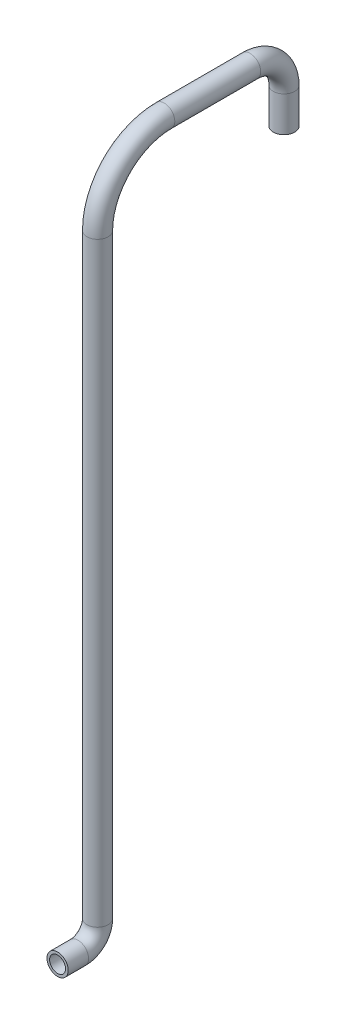
ISO-10303-21;
HEADER;
FILE_DESCRIPTION(('STEP AP214'),'2;1');
FILE_NAME('part.step','',(''),(''),'','','');
FILE_SCHEMA(('AUTOMOTIVE_DESIGN { 1 0 10303 214 1 1 1 1 }'));
ENDSEC;
DATA;
#1=APPLICATION_CONTEXT('core data for automotive mechanical design processes');
#2=APPLICATION_PROTOCOL_DEFINITION('international standard','automotive_design',2000,#1);
#3=PRODUCT_CONTEXT('',#1,'mechanical');
#4=PRODUCT('Part','Part','',(#3));
#5=PRODUCT_RELATED_PRODUCT_CATEGORY('part','',(#4));
#6=PRODUCT_DEFINITION_FORMATION('','',#4);
#7=PRODUCT_DEFINITION_CONTEXT('part definition',#1,'design');
#8=PRODUCT_DEFINITION('design','',#6,#7);
#9=PRODUCT_DEFINITION_SHAPE('','',#8);
#10=(LENGTH_UNIT() NAMED_UNIT(*) SI_UNIT(.MILLI.,.METRE.));
#11=(NAMED_UNIT(*) PLANE_ANGLE_UNIT() SI_UNIT($,.RADIAN.));
#12=(NAMED_UNIT(*) SI_UNIT($,.STERADIAN.) SOLID_ANGLE_UNIT());
#13=UNCERTAINTY_MEASURE_WITH_UNIT(LENGTH_MEASURE(1.E-05),#10,'distance_accuracy_value','');
#14=(GEOMETRIC_REPRESENTATION_CONTEXT(3) GLOBAL_UNCERTAINTY_ASSIGNED_CONTEXT((#13)) GLOBAL_UNIT_ASSIGNED_CONTEXT((#10,
#11,#12)) REPRESENTATION_CONTEXT('',''));
#15=CARTESIAN_POINT('',(0.,0.,0.));
#16=DIRECTION('',(0.,0.,1.));
#17=DIRECTION('',(1.,0.,0.));
#18=AXIS2_PLACEMENT_3D('',#15,#16,#17);
#19=CARTESIAN_POINT('',(0.,230.,-85.));
#20=DIRECTION('',(0.,1.,0.));
#21=DIRECTION('',(0.,0.,1.));
#22=AXIS2_PLACEMENT_3D('',#19,#20,#21);
#23=PLANE('',#22);
#24=CARTESIAN_POINT('',(0.,230.,-85.));
#25=DIRECTION('',(0.,1.,0.));
#26=DIRECTION('',(0.,0.,1.));
#27=AXIS2_PLACEMENT_3D('',#24,#25,#26);
#28=CIRCLE('',#27,3.);
#29=CARTESIAN_POINT('',(0.,230.,-82.));
#30=VERTEX_POINT('',#29);
#31=EDGE_CURVE('E286',#30,#30,#28,.T.);
#32=ORIENTED_EDGE('',*,*,#31,.T.);
#33=EDGE_LOOP('',(#32));
#34=FACE_BOUND('',#33,.T.);
#35=CARTESIAN_POINT('',(0.,230.,-85.));
#36=DIRECTION('',(0.,1.,0.));
#37=DIRECTION('',(0.,0.,1.));
#38=AXIS2_PLACEMENT_3D('',#35,#36,#37);
#39=CIRCLE('',#38,4.);
#40=CARTESIAN_POINT('',(0.,230.,-81.));
#41=VERTEX_POINT('',#40);
#42=EDGE_CURVE('E70',#41,#41,#39,.T.);
#43=ORIENTED_EDGE('',*,*,#42,.F.);
#44=EDGE_LOOP('',(#43));
#45=FACE_BOUND('',#44,.T.);
#46=ADVANCED_FACE('F67',(#34,#45),#23,.F.);
#47=CARTESIAN_POINT('',(0.,0.,0.));
#48=DIRECTION('',(0.,0.,1.));
#49=DIRECTION('',(0.,-1.,0.));
#50=AXIS2_PLACEMENT_3D('',#47,#48,#49);
#51=PLANE('',#50);
#52=CARTESIAN_POINT('',(0.,0.,0.));
#53=DIRECTION('',(0.,0.,1.));
#54=DIRECTION('',(0.,-1.,0.));
#55=AXIS2_PLACEMENT_3D('',#52,#53,#54);
#56=CIRCLE('',#55,3.);
#57=CARTESIAN_POINT('',(0.,-2.99999999999994,0.));
#58=VERTEX_POINT('',#57);
#59=EDGE_CURVE('E297',#58,#58,#56,.T.);
#60=ORIENTED_EDGE('',*,*,#59,.F.);
#61=EDGE_LOOP('',(#60));
#62=FACE_BOUND('',#61,.T.);
#63=CARTESIAN_POINT('',(0.,0.,0.));
#64=DIRECTION('',(0.,0.,1.));
#65=DIRECTION('',(0.,-1.,0.));
#66=AXIS2_PLACEMENT_3D('',#63,#64,#65);
#67=CIRCLE('',#66,4.);
#68=CARTESIAN_POINT('',(0.,-3.99999999999994,0.));
#69=VERTEX_POINT('',#68);
#70=EDGE_CURVE('E84',#69,#69,#67,.T.);
#71=ORIENTED_EDGE('',*,*,#70,.T.);
#72=EDGE_LOOP('',(#71));
#73=FACE_BOUND('',#72,.T.);
#74=ADVANCED_FACE('F108',(#62,#73),#51,.T.);
#75=CARTESIAN_POINT('',(0.,243.26,-85.));
#76=DIRECTION('',(0.,-1.,0.));
#77=DIRECTION('',(0.,0.,-1.));
#78=AXIS2_PLACEMENT_3D('',#75,#76,#77);
#79=CYLINDRICAL_SURFACE('',#78,4.);
#80=ORIENTED_EDGE('',*,*,#42,.T.);
#81=EDGE_LOOP('',(#80));
#82=FACE_BOUND('',#81,.T.);
#83=CARTESIAN_POINT('',(0.,243.26,-85.));
#84=DIRECTION('',(0.,0.999999999999995,1.05137579974254E-07));
#85=DIRECTION('',(0.,-1.05137579974254E-07,0.999999999999994));
#86=AXIS2_PLACEMENT_3D('',#83,#84,#85);
#87=CIRCLE('',#86,4.);
#88=CARTESIAN_POINT('',(0.,243.26000042055,-89.));
#89=VERTEX_POINT('',#88);
#90=EDGE_CURVE('E95',#89,#89,#87,.T.);
#91=ORIENTED_EDGE('',*,*,#90,.F.);
#92=EDGE_LOOP('',(#91));
#93=FACE_BOUND('',#92,.T.);
#94=ADVANCED_FACE('F106',(#82,#93),#79,.T.);
#95=CARTESIAN_POINT('',(0.,256.,-40.));
#96=DIRECTION('',(0.,0.,-1.));
#97=DIRECTION('',(-1.,0.,0.));
#98=AXIS2_PLACEMENT_3D('',#95,#96,#97);
#99=CYLINDRICAL_SURFACE('',#98,4.);
#100=CARTESIAN_POINT('',(0.,256.,-72.259998660547));
#101=DIRECTION('',(0.,0.,1.));
#102=DIRECTION('',(0.,-1.,0.));
#103=AXIS2_PLACEMENT_3D('',#100,#101,#102);
#104=CIRCLE('',#103,4.);
#105=CARTESIAN_POINT('',(0.,260.,-72.259998660547));
#106=VERTEX_POINT('',#105);
#107=EDGE_CURVE('E92',#106,#106,#104,.T.);
#108=ORIENTED_EDGE('',*,*,#107,.T.);
#109=EDGE_LOOP('',(#108));
#110=FACE_BOUND('',#109,.T.);
#111=CARTESIAN_POINT('',(0.,256.,-40.));
#112=DIRECTION('',(0.,6.42331454317771E-08,0.999999999999998));
#113=DIRECTION('',(0.,-0.999999999999998,6.42331454317771E-08));
#114=AXIS2_PLACEMENT_3D('',#111,#112,#113);
#115=CIRCLE('',#114,4.);
#116=CARTESIAN_POINT('',(0.,260.,-40.0000002569325));
#117=VERTEX_POINT('',#116);
#118=EDGE_CURVE('E93',#117,#117,#115,.T.);
#119=ORIENTED_EDGE('',*,*,#118,.F.);
#120=EDGE_LOOP('',(#119));
#121=FACE_BOUND('',#120,.T.);
#122=ADVANCED_FACE('F107',(#110,#121),#99,.T.);
#123=CARTESIAN_POINT('',(0.,243.259998660547,-72.2599986605471));
#124=DIRECTION('',(-1.,0.,0.));
#125=DIRECTION('',(0.,0.,1.));
#126=AXIS2_PLACEMENT_3D('',#123,#124,#125);
#127=TOROIDAL_SURFACE('',#126,12.740001339453,4.);
#128=CARTESIAN_POINT('',(0.,243.259998660547,-72.2599986605471));
#129=DIRECTION('',(-1.,0.,0.));
#130=DIRECTION('',(0.,0.,1.));
#131=AXIS2_PLACEMENT_3D('',#128,#129,#130);
#132=CIRCLE('',#131,16.740001339453);
#133=EDGE_CURVE('',#106,#89,#132,.T.);
#134=ORIENTED_EDGE('',*,*,#107,.F.);
#135=ORIENTED_EDGE('',*,*,#90,.T.);
#136=ORIENTED_EDGE('',*,*,#133,.T.);
#137=ORIENTED_EDGE('',*,*,#133,.F.);
#138=EDGE_LOOP('',(#134,#136,#135,#137));
#139=FACE_BOUND('',#138,.T.);
#140=ADVANCED_FACE('F103',(#139),#127,.T.);
#141=CARTESIAN_POINT('',(0.,7.34999999999997,-14.9999999999999));
#142=DIRECTION('',(0.,1.,0.));
#143=DIRECTION('',(0.,0.,1.));
#144=AXIS2_PLACEMENT_3D('',#141,#142,#143);
#145=CYLINDRICAL_SURFACE('',#144,4.);
#146=CARTESIAN_POINT('',(0.,231.000001605829,-14.9999999999999));
#147=DIRECTION('',(0.,-1.,0.));
#148=DIRECTION('',(0.,0.,-1.));
#149=AXIS2_PLACEMENT_3D('',#146,#147,#148);
#150=CIRCLE('',#149,4.);
#151=CARTESIAN_POINT('',(0.,231.000001605829,-10.9999999999999));
#152=VERTEX_POINT('',#151);
#153=EDGE_CURVE('E87',#152,#152,#150,.T.);
#154=ORIENTED_EDGE('',*,*,#153,.T.);
#155=EDGE_LOOP('',(#154));
#156=FACE_BOUND('',#155,.T.);
#157=CARTESIAN_POINT('',(0.,7.34999999999994,-14.9999999999999));
#158=DIRECTION('',(0.,-0.999999999999997,-7.35235215500691E-08));
#159=DIRECTION('',(0.,7.3523521550069E-08,-0.999999999999997));
#160=AXIS2_PLACEMENT_3D('',#157,#158,#159);
#161=CIRCLE('',#160,4.);
#162=CARTESIAN_POINT('',(0.,7.35000029409399,-18.9999999999999));
#163=VERTEX_POINT('',#162);
#164=EDGE_CURVE('E11',#163,#163,#161,.T.);
#165=ORIENTED_EDGE('',*,*,#164,.F.);
#166=EDGE_LOOP('',(#165));
#167=FACE_BOUND('',#166,.T.);
#168=ADVANCED_FACE('F137',(#156,#167),#145,.T.);
#169=CARTESIAN_POINT('',(0.,231.000001605829,-39.9999983941715));
#170=DIRECTION('',(-1.,0.,0.));
#171=DIRECTION('',(0.,0.,1.));
#172=AXIS2_PLACEMENT_3D('',#169,#170,#171);
#173=TOROIDAL_SURFACE('',#172,24.9999983941716,4.);
#174=CARTESIAN_POINT('',(0.,231.000001605829,-39.9999983941715));
#175=DIRECTION('',(-1.,0.,0.));
#176=DIRECTION('',(0.,0.,1.));
#177=AXIS2_PLACEMENT_3D('',#174,#175,#176);
#178=CIRCLE('',#177,28.9999983941716);
#179=EDGE_CURVE('',#152,#117,#178,.T.);
#180=ORIENTED_EDGE('',*,*,#153,.F.);
#181=ORIENTED_EDGE('',*,*,#118,.T.);
#182=ORIENTED_EDGE('',*,*,#179,.T.);
#183=ORIENTED_EDGE('',*,*,#179,.F.);
#184=EDGE_LOOP('',(#180,#182,#181,#183));
#185=FACE_BOUND('',#184,.T.);
#186=ADVANCED_FACE('F135',(#185),#173,.T.);
#187=CARTESIAN_POINT('',(0.,0.,0.));
#188=DIRECTION('',(0.,0.,-1.));
#189=DIRECTION('',(-1.,0.,0.));
#190=AXIS2_PLACEMENT_3D('',#187,#188,#189);
#191=CYLINDRICAL_SURFACE('',#190,4.);
#192=CARTESIAN_POINT('',(0.,0.,-7.6500005403978));
#193=DIRECTION('',(0.,0.,1.));
#194=DIRECTION('',(0.,-1.,0.));
#195=AXIS2_PLACEMENT_3D('',#192,#193,#194);
#196=CIRCLE('',#195,4.);
#197=CARTESIAN_POINT('',(0.,-3.99999999999996,-7.65000054039778));
#198=VERTEX_POINT('',#197);
#199=EDGE_CURVE('E73',#198,#198,#196,.T.);
#200=ORIENTED_EDGE('',*,*,#199,.T.);
#201=EDGE_LOOP('',(#200));
#202=FACE_BOUND('',#201,.T.);
#203=ORIENTED_EDGE('',*,*,#70,.F.);
#204=EDGE_LOOP('',(#203));
#205=FACE_BOUND('',#204,.T.);
#206=ADVANCED_FACE('F124',(#202,#205),#191,.T.);
#207=CARTESIAN_POINT('',(0.,7.34999945960216,-7.65000054039784));
#208=DIRECTION('',(1.,0.,0.));
#209=DIRECTION('',(0.,0.,-1.));
#210=AXIS2_PLACEMENT_3D('',#207,#208,#209);
#211=TOROIDAL_SURFACE('',#210,7.34999945960212,4.);
#212=CARTESIAN_POINT('',(0.,7.34999945960216,-7.65000054039784));
#213=DIRECTION('',(1.,0.,0.));
#214=DIRECTION('',(0.,0.,-1.));
#215=AXIS2_PLACEMENT_3D('',#212,#213,#214);
#216=CIRCLE('',#215,11.3499994596021);
#217=EDGE_CURVE('',#198,#163,#216,.T.);
#218=ORIENTED_EDGE('',*,*,#199,.F.);
#219=ORIENTED_EDGE('',*,*,#164,.T.);
#220=ORIENTED_EDGE('',*,*,#217,.T.);
#221=ORIENTED_EDGE('',*,*,#217,.F.);
#222=EDGE_LOOP('',(#218,#220,#219,#221));
#223=FACE_BOUND('',#222,.T.);
#224=ADVANCED_FACE('F118',(#223),#211,.T.);
#225=CARTESIAN_POINT('',(0.,0.,1.));
#226=DIRECTION('',(0.,0.,-1.));
#227=DIRECTION('',(-1.,0.,0.));
#228=AXIS2_PLACEMENT_3D('',#225,#226,#227);
#229=CYLINDRICAL_SURFACE('',#228,3.);
#230=CARTESIAN_POINT('',(0.,0.,-7.6500005403978));
#231=DIRECTION('',(0.,0.,1.));
#232=DIRECTION('',(0.,-1.,0.));
#233=AXIS2_PLACEMENT_3D('',#230,#231,#232);
#234=CIRCLE('',#233,3.);
#235=CARTESIAN_POINT('',(0.,-2.99999999999996,-7.65000054039778));
#236=VERTEX_POINT('',#235);
#237=EDGE_CURVE('E281',#236,#236,#234,.T.);
#238=ORIENTED_EDGE('',*,*,#237,.F.);
#239=EDGE_LOOP('',(#238));
#240=FACE_BOUND('',#239,.T.);
#241=ORIENTED_EDGE('',*,*,#59,.T.);
#242=EDGE_LOOP('',(#241));
#243=FACE_BOUND('',#242,.T.);
#244=ADVANCED_FACE('F122',(#240,#243),#229,.F.);
#245=CARTESIAN_POINT('',(0.,243.26,-85.));
#246=DIRECTION('',(0.,-1.,0.));
#247=DIRECTION('',(0.,0.,-1.));
#248=AXIS2_PLACEMENT_3D('',#245,#246,#247);
#249=CYLINDRICAL_SURFACE('',#248,3.);
#250=ORIENTED_EDGE('',*,*,#31,.F.);
#251=EDGE_LOOP('',(#250));
#252=FACE_BOUND('',#251,.T.);
#253=CARTESIAN_POINT('',(0.,243.26,-85.));
#254=DIRECTION('',(0.,0.999999999999995,1.05137579974254E-07));
#255=DIRECTION('',(0.,-1.05137579974254E-07,0.999999999999994));
#256=AXIS2_PLACEMENT_3D('',#253,#254,#255);
#257=CIRCLE('',#256,3.);
#258=CARTESIAN_POINT('',(0.,243.260000315413,-88.));
#259=VERTEX_POINT('',#258);
#260=EDGE_CURVE('E302',#259,#259,#257,.T.);
#261=ORIENTED_EDGE('',*,*,#260,.T.);
#262=EDGE_LOOP('',(#261));
#263=FACE_BOUND('',#262,.T.);
#264=ADVANCED_FACE('F126',(#252,#263),#249,.F.);
#265=CARTESIAN_POINT('',(0.,256.,-40.));
#266=DIRECTION('',(0.,0.,-1.));
#267=DIRECTION('',(-1.,0.,0.));
#268=AXIS2_PLACEMENT_3D('',#265,#266,#267);
#269=CYLINDRICAL_SURFACE('',#268,3.);
#270=CARTESIAN_POINT('',(0.,256.,-72.259998660547));
#271=DIRECTION('',(0.,0.,1.));
#272=DIRECTION('',(0.,-1.,0.));
#273=AXIS2_PLACEMENT_3D('',#270,#271,#272);
#274=CIRCLE('',#273,3.);
#275=CARTESIAN_POINT('',(0.,259.,-72.259998660547));
#276=VERTEX_POINT('',#275);
#277=EDGE_CURVE('E292',#276,#276,#274,.T.);
#278=ORIENTED_EDGE('',*,*,#277,.F.);
#279=EDGE_LOOP('',(#278));
#280=FACE_BOUND('',#279,.T.);
#281=CARTESIAN_POINT('',(0.,256.,-40.));
#282=DIRECTION('',(0.,6.42331454317771E-08,0.999999999999998));
#283=DIRECTION('',(0.,-0.999999999999998,6.42331454317771E-08));
#284=AXIS2_PLACEMENT_3D('',#281,#282,#283);
#285=CIRCLE('',#284,3.);
#286=CARTESIAN_POINT('',(0.,259.,-40.0000001926994));
#287=VERTEX_POINT('',#286);
#288=EDGE_CURVE('E300',#287,#287,#285,.T.);
#289=ORIENTED_EDGE('',*,*,#288,.T.);
#290=EDGE_LOOP('',(#289));
#291=FACE_BOUND('',#290,.T.);
#292=ADVANCED_FACE('F191',(#280,#291),#269,.F.);
#293=CARTESIAN_POINT('',(0.,243.259998660547,-72.2599986605471));
#294=DIRECTION('',(-1.,0.,0.));
#295=DIRECTION('',(0.,0.,1.));
#296=AXIS2_PLACEMENT_3D('',#293,#294,#295);
#297=TOROIDAL_SURFACE('',#296,12.740001339453,3.);
#298=CARTESIAN_POINT('',(0.,243.259998660547,-72.2599986605471));
#299=DIRECTION('',(-1.,0.,0.));
#300=DIRECTION('',(0.,0.,1.));
#301=AXIS2_PLACEMENT_3D('',#298,#299,#300);
#302=CIRCLE('',#301,15.740001339453);
#303=EDGE_CURVE('',#276,#259,#302,.T.);
#304=ORIENTED_EDGE('',*,*,#277,.T.);
#305=ORIENTED_EDGE('',*,*,#260,.F.);
#306=ORIENTED_EDGE('',*,*,#303,.T.);
#307=ORIENTED_EDGE('',*,*,#303,.F.);
#308=EDGE_LOOP('',(#304,#306,#305,#307));
#309=FACE_BOUND('',#308,.T.);
#310=ADVANCED_FACE('F203',(#309),#297,.F.);
#311=CARTESIAN_POINT('',(0.,7.34999999999997,-14.9999999999999));
#312=DIRECTION('',(0.,1.,0.));
#313=DIRECTION('',(0.,0.,1.));
#314=AXIS2_PLACEMENT_3D('',#311,#312,#313);
#315=CYLINDRICAL_SURFACE('',#314,3.);
#316=CARTESIAN_POINT('',(0.,231.000001605829,-14.9999999999999));
#317=DIRECTION('',(0.,-1.,0.));
#318=DIRECTION('',(0.,0.,-1.));
#319=AXIS2_PLACEMENT_3D('',#316,#317,#318);
#320=CIRCLE('',#319,3.);
#321=CARTESIAN_POINT('',(0.,231.000001605829,-11.9999999999999));
#322=VERTEX_POINT('',#321);
#323=EDGE_CURVE('E299',#322,#322,#320,.T.);
#324=ORIENTED_EDGE('',*,*,#323,.F.);
#325=EDGE_LOOP('',(#324));
#326=FACE_BOUND('',#325,.T.);
#327=CARTESIAN_POINT('',(0.,7.34999999999994,-14.9999999999999));
#328=DIRECTION('',(0.,-0.999999999999997,-7.35235215500691E-08));
#329=DIRECTION('',(0.,7.3523521550069E-08,-0.999999999999997));
#330=AXIS2_PLACEMENT_3D('',#327,#328,#329);
#331=CIRCLE('',#330,3.);
#332=CARTESIAN_POINT('',(0.,7.35000022057048,-17.9999999999999));
#333=VERTEX_POINT('',#332);
#334=EDGE_CURVE('E282',#333,#333,#331,.T.);
#335=ORIENTED_EDGE('',*,*,#334,.T.);
#336=EDGE_LOOP('',(#335));
#337=FACE_BOUND('',#336,.T.);
#338=ADVANCED_FACE('F211',(#326,#337),#315,.F.);
#339=CARTESIAN_POINT('',(0.,231.000001605829,-39.9999983941715));
#340=DIRECTION('',(-1.,0.,0.));
#341=DIRECTION('',(0.,0.,1.));
#342=AXIS2_PLACEMENT_3D('',#339,#340,#341);
#343=TOROIDAL_SURFACE('',#342,24.9999983941716,3.);
#344=CARTESIAN_POINT('',(0.,231.000001605829,-39.9999983941715));
#345=DIRECTION('',(-1.,0.,0.));
#346=DIRECTION('',(0.,0.,1.));
#347=AXIS2_PLACEMENT_3D('',#344,#345,#346);
#348=CIRCLE('',#347,27.9999983941716);
#349=EDGE_CURVE('',#322,#287,#348,.T.);
#350=ORIENTED_EDGE('',*,*,#323,.T.);
#351=ORIENTED_EDGE('',*,*,#288,.F.);
#352=ORIENTED_EDGE('',*,*,#349,.T.);
#353=ORIENTED_EDGE('',*,*,#349,.F.);
#354=EDGE_LOOP('',(#350,#352,#351,#353));
#355=FACE_BOUND('',#354,.T.);
#356=ADVANCED_FACE('F222',(#355),#343,.F.);
#357=CARTESIAN_POINT('',(0.,7.34999945960216,-7.65000054039784));
#358=DIRECTION('',(1.,0.,0.));
#359=DIRECTION('',(0.,0.,-1.));
#360=AXIS2_PLACEMENT_3D('',#357,#358,#359);
#361=TOROIDAL_SURFACE('',#360,7.34999945960212,3.);
#362=CARTESIAN_POINT('',(0.,7.34999945960216,-7.65000054039784));
#363=DIRECTION('',(1.,0.,0.));
#364=DIRECTION('',(0.,0.,-1.));
#365=AXIS2_PLACEMENT_3D('',#362,#363,#364);
#366=CIRCLE('',#365,10.3499994596021);
#367=EDGE_CURVE('',#236,#333,#366,.T.);
#368=ORIENTED_EDGE('',*,*,#237,.T.);
#369=ORIENTED_EDGE('',*,*,#334,.F.);
#370=ORIENTED_EDGE('',*,*,#367,.T.);
#371=ORIENTED_EDGE('',*,*,#367,.F.);
#372=EDGE_LOOP('',(#368,#370,#369,#371));
#373=FACE_BOUND('',#372,.T.);
#374=ADVANCED_FACE('F132',(#373),#361,.F.);
#375=CLOSED_SHELL('',(#46,#74,#94,#122,#140,#168,#186,#206,#224,#244,#264,#292,#310,#338,#356,#374));
#376=MANIFOLD_SOLID_BREP('B2',#375);
#377=ADVANCED_BREP_SHAPE_REPRESENTATION('',(#18,#376),#14);
#378=SHAPE_DEFINITION_REPRESENTATION(#9,#377);
ENDSEC;
END-ISO-10303-21;
